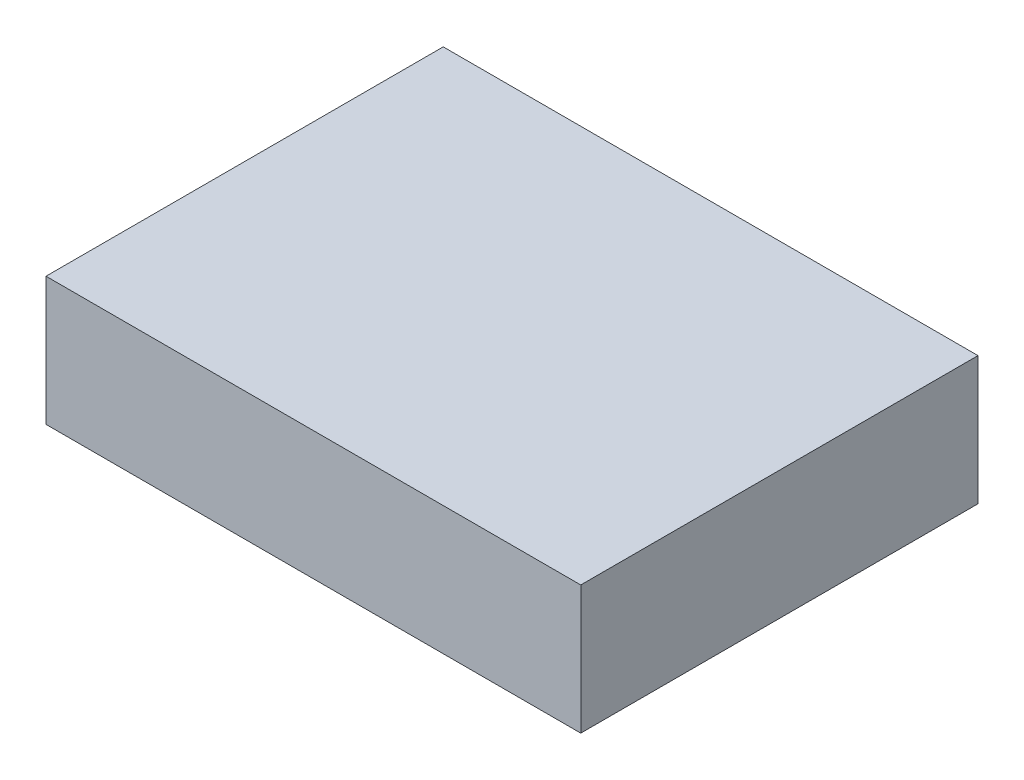
ISO-10303-21;
HEADER;
FILE_DESCRIPTION(('STEP AP214'),'2;1');
FILE_NAME('part.step','',(''),(''),'','','');
FILE_SCHEMA(('AUTOMOTIVE_DESIGN { 1 0 10303 214 1 1 1 1 }'));
ENDSEC;
DATA;
#1=APPLICATION_CONTEXT('core data for automotive mechanical design processes');
#2=APPLICATION_PROTOCOL_DEFINITION('international standard','automotive_design',2000,#1);
#3=PRODUCT_CONTEXT('',#1,'mechanical');
#4=PRODUCT('Part','Part','',(#3));
#5=PRODUCT_RELATED_PRODUCT_CATEGORY('part','',(#4));
#6=PRODUCT_DEFINITION_FORMATION('','',#4);
#7=PRODUCT_DEFINITION_CONTEXT('part definition',#1,'design');
#8=PRODUCT_DEFINITION('design','',#6,#7);
#9=PRODUCT_DEFINITION_SHAPE('','',#8);
#10=(LENGTH_UNIT() NAMED_UNIT(*) SI_UNIT(.MILLI.,.METRE.));
#11=(NAMED_UNIT(*) PLANE_ANGLE_UNIT() SI_UNIT($,.RADIAN.));
#12=(NAMED_UNIT(*) SI_UNIT($,.STERADIAN.) SOLID_ANGLE_UNIT());
#13=UNCERTAINTY_MEASURE_WITH_UNIT(LENGTH_MEASURE(1.E-05),#10,'distance_accuracy_value','');
#14=(GEOMETRIC_REPRESENTATION_CONTEXT(3) GLOBAL_UNCERTAINTY_ASSIGNED_CONTEXT((#13)) GLOBAL_UNIT_ASSIGNED_CONTEXT((#10,
#11,#12)) REPRESENTATION_CONTEXT('',''));
#15=CARTESIAN_POINT('',(0.,0.,0.));
#16=DIRECTION('',(0.,0.,1.));
#17=DIRECTION('',(1.,0.,0.));
#18=AXIS2_PLACEMENT_3D('',#15,#16,#17);
#19=CARTESIAN_POINT('',(437.5,-210.,1.09605888523688E-13));
#20=DIRECTION('',(1.,0.,0.));
#21=DIRECTION('',(0.,0.,-1.));
#22=AXIS2_PLACEMENT_3D('',#19,#20,#21);
#23=PLANE('',#22);
#24=DIRECTION('',(0.,0.,-1.));
#25=VECTOR('',#24,1.);
#26=CARTESIAN_POINT('',(437.5,0.,1.09605888523688E-13));
#27=LINE('',#26,#25);
#28=CARTESIAN_POINT('',(437.5,0.,1.09605888523688E-13));
#29=VERTEX_POINT('',#28);
#30=CARTESIAN_POINT('',(437.5,0.,-650.));
#31=VERTEX_POINT('',#30);
#32=EDGE_CURVE('E99',#29,#31,#27,.T.);
#33=ORIENTED_EDGE('',*,*,#32,.F.);
#34=DIRECTION('',(0.,1.,0.));
#35=VECTOR('',#34,1.);
#36=CARTESIAN_POINT('',(437.5,-210.,1.09605888523688E-13));
#37=LINE('',#36,#35);
#38=CARTESIAN_POINT('',(437.5,-210.,1.09605888523688E-13));
#39=VERTEX_POINT('',#38);
#40=EDGE_CURVE('E11',#39,#29,#37,.T.);
#41=ORIENTED_EDGE('',*,*,#40,.F.);
#42=DIRECTION('',(0.,0.,-1.));
#43=VECTOR('',#42,1.);
#44=CARTESIAN_POINT('',(437.5,-210.,1.09605888523688E-13));
#45=LINE('',#44,#43);
#46=CARTESIAN_POINT('',(437.5,-210.,-650.));
#47=VERTEX_POINT('',#46);
#48=EDGE_CURVE('E93',#39,#47,#45,.T.);
#49=ORIENTED_EDGE('',*,*,#48,.T.);
#50=DIRECTION('',(0.,1.,0.));
#51=VECTOR('',#50,1.);
#52=CARTESIAN_POINT('',(437.5,-210.,-650.));
#53=LINE('',#52,#51);
#54=EDGE_CURVE('E38',#47,#31,#53,.T.);
#55=ORIENTED_EDGE('',*,*,#54,.T.);
#56=EDGE_LOOP('',(#33,#41,#49,#55));
#57=FACE_BOUND('',#56,.T.);
#58=ADVANCED_FACE('F35',(#57),#23,.T.);
#59=CARTESIAN_POINT('',(437.5,-210.,1.09605888523688E-13));
#60=DIRECTION('',(0.,0.,1.));
#61=DIRECTION('',(1.,0.,0.));
#62=AXIS2_PLACEMENT_3D('',#59,#60,#61);
#63=PLANE('',#62);
#64=DIRECTION('',(1.,0.,0.));
#65=VECTOR('',#64,1.);
#66=CARTESIAN_POINT('',(437.5,0.,1.09605888523688E-13));
#67=LINE('',#66,#65);
#68=CARTESIAN_POINT('',(-437.5,0.,1.09605888523688E-13));
#69=VERTEX_POINT('',#68);
#70=EDGE_CURVE('E95',#69,#29,#67,.T.);
#71=ORIENTED_EDGE('',*,*,#70,.F.);
#72=DIRECTION('',(0.,1.,0.));
#73=VECTOR('',#72,1.);
#74=CARTESIAN_POINT('',(-437.5,-210.,1.09605888523688E-13));
#75=LINE('',#74,#73);
#76=CARTESIAN_POINT('',(-437.5,-210.,1.09605888523688E-13));
#77=VERTEX_POINT('',#76);
#78=EDGE_CURVE('E44',#77,#69,#75,.T.);
#79=ORIENTED_EDGE('',*,*,#78,.F.);
#80=DIRECTION('',(1.,0.,0.));
#81=VECTOR('',#80,1.);
#82=CARTESIAN_POINT('',(437.5,-210.,1.09605888523688E-13));
#83=LINE('',#82,#81);
#84=EDGE_CURVE('E90',#77,#39,#83,.T.);
#85=ORIENTED_EDGE('',*,*,#84,.T.);
#86=ORIENTED_EDGE('',*,*,#40,.T.);
#87=EDGE_LOOP('',(#71,#79,#85,#86));
#88=FACE_BOUND('',#87,.T.);
#89=ADVANCED_FACE('F109',(#88),#63,.T.);
#90=CARTESIAN_POINT('',(-437.5,-210.,1.09605888523688E-13));
#91=DIRECTION('',(-1.,0.,0.));
#92=DIRECTION('',(0.,0.,1.));
#93=AXIS2_PLACEMENT_3D('',#90,#91,#92);
#94=PLANE('',#93);
#95=DIRECTION('',(0.,0.,1.));
#96=VECTOR('',#95,1.);
#97=CARTESIAN_POINT('',(-437.5,0.,1.09605888523688E-13));
#98=LINE('',#97,#96);
#99=CARTESIAN_POINT('',(-437.5,0.,-650.));
#100=VERTEX_POINT('',#99);
#101=EDGE_CURVE('E85',#100,#69,#98,.T.);
#102=ORIENTED_EDGE('',*,*,#101,.F.);
#103=DIRECTION('',(0.,1.,0.));
#104=VECTOR('',#103,1.);
#105=CARTESIAN_POINT('',(-437.5,-210.,-650.));
#106=LINE('',#105,#104);
#107=CARTESIAN_POINT('',(-437.5,-210.,-650.));
#108=VERTEX_POINT('',#107);
#109=EDGE_CURVE('E80',#108,#100,#106,.T.);
#110=ORIENTED_EDGE('',*,*,#109,.F.);
#111=DIRECTION('',(0.,0.,1.));
#112=VECTOR('',#111,1.);
#113=CARTESIAN_POINT('',(-437.5,-210.,1.09605888523688E-13));
#114=LINE('',#113,#112);
#115=EDGE_CURVE('E83',#108,#77,#114,.T.);
#116=ORIENTED_EDGE('',*,*,#115,.T.);
#117=ORIENTED_EDGE('',*,*,#78,.T.);
#118=EDGE_LOOP('',(#102,#110,#116,#117));
#119=FACE_BOUND('',#118,.T.);
#120=ADVANCED_FACE('F82',(#119),#94,.T.);
#121=CARTESIAN_POINT('',(437.5,-210.,-650.));
#122=DIRECTION('',(0.,0.,-1.));
#123=DIRECTION('',(-1.,0.,0.));
#124=AXIS2_PLACEMENT_3D('',#121,#122,#123);
#125=PLANE('',#124);
#126=DIRECTION('',(-1.,0.,0.));
#127=VECTOR('',#126,1.);
#128=CARTESIAN_POINT('',(437.5,0.,-650.));
#129=LINE('',#128,#127);
#130=EDGE_CURVE('E102',#31,#100,#129,.T.);
#131=ORIENTED_EDGE('',*,*,#130,.F.);
#132=ORIENTED_EDGE('',*,*,#54,.F.);
#133=DIRECTION('',(-1.,0.,0.));
#134=VECTOR('',#133,1.);
#135=CARTESIAN_POINT('',(437.5,-210.,-650.));
#136=LINE('',#135,#134);
#137=EDGE_CURVE('E89',#47,#108,#136,.T.);
#138=ORIENTED_EDGE('',*,*,#137,.T.);
#139=ORIENTED_EDGE('',*,*,#109,.T.);
#140=EDGE_LOOP('',(#131,#132,#138,#139));
#141=FACE_BOUND('',#140,.T.);
#142=ADVANCED_FACE('F92',(#141),#125,.T.);
#143=CARTESIAN_POINT('',(0.,-210.,0.));
#144=DIRECTION('',(0.,1.,0.));
#145=DIRECTION('',(0.,0.,1.));
#146=AXIS2_PLACEMENT_3D('',#143,#144,#145);
#147=PLANE('',#146);
#148=ORIENTED_EDGE('',*,*,#48,.F.);
#149=ORIENTED_EDGE('',*,*,#84,.F.);
#150=ORIENTED_EDGE('',*,*,#115,.F.);
#151=ORIENTED_EDGE('',*,*,#137,.F.);
#152=EDGE_LOOP('',(#148,#149,#150,#151));
#153=FACE_BOUND('',#152,.T.);
#154=ADVANCED_FACE('F88',(#153),#147,.F.);
#155=CARTESIAN_POINT('',(0.,0.,0.));
#156=DIRECTION('',(0.,1.,0.));
#157=DIRECTION('',(0.,0.,1.));
#158=AXIS2_PLACEMENT_3D('',#155,#156,#157);
#159=PLANE('',#158);
#160=ORIENTED_EDGE('',*,*,#32,.T.);
#161=ORIENTED_EDGE('',*,*,#130,.T.);
#162=ORIENTED_EDGE('',*,*,#101,.T.);
#163=ORIENTED_EDGE('',*,*,#70,.T.);
#164=EDGE_LOOP('',(#160,#161,#162,#163));
#165=FACE_BOUND('',#164,.T.);
#166=ADVANCED_FACE('F108',(#165),#159,.T.);
#167=CLOSED_SHELL('',(#58,#89,#120,#142,#154,#166));
#168=MANIFOLD_SOLID_BREP('B2',#167);
#169=ADVANCED_BREP_SHAPE_REPRESENTATION('',(#18,#168),#14);
#170=SHAPE_DEFINITION_REPRESENTATION(#9,#169);
ENDSEC;
END-ISO-10303-21;
